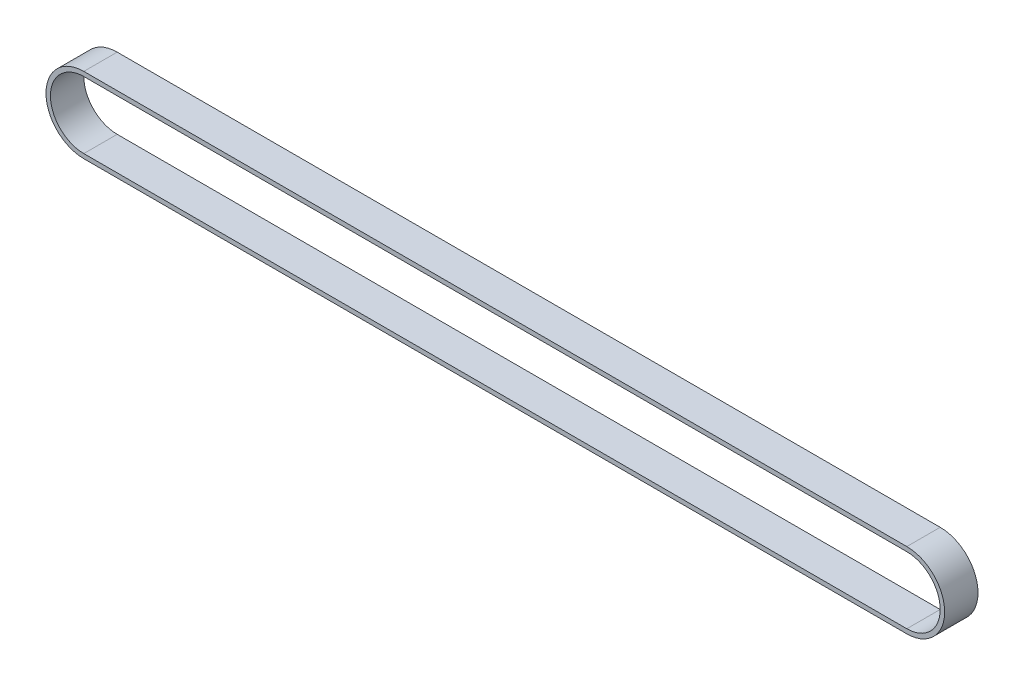
ISO-10303-21;
HEADER;
FILE_DESCRIPTION(('STEP AP214'),'2;1');
FILE_NAME('part.step','',(''),(''),'','','');
FILE_SCHEMA(('AUTOMOTIVE_DESIGN { 1 0 10303 214 1 1 1 1 }'));
ENDSEC;
DATA;
#1=APPLICATION_CONTEXT('core data for automotive mechanical design processes');
#2=APPLICATION_PROTOCOL_DEFINITION('international standard','automotive_design',2000,#1);
#3=PRODUCT_CONTEXT('',#1,'mechanical');
#4=PRODUCT('Part','Part','',(#3));
#5=PRODUCT_RELATED_PRODUCT_CATEGORY('part','',(#4));
#6=PRODUCT_DEFINITION_FORMATION('','',#4);
#7=PRODUCT_DEFINITION_CONTEXT('part definition',#1,'design');
#8=PRODUCT_DEFINITION('design','',#6,#7);
#9=PRODUCT_DEFINITION_SHAPE('','',#8);
#10=(LENGTH_UNIT() NAMED_UNIT(*) SI_UNIT(.MILLI.,.METRE.));
#11=(NAMED_UNIT(*) PLANE_ANGLE_UNIT() SI_UNIT($,.RADIAN.));
#12=(NAMED_UNIT(*) SI_UNIT($,.STERADIAN.) SOLID_ANGLE_UNIT());
#13=UNCERTAINTY_MEASURE_WITH_UNIT(LENGTH_MEASURE(1.E-05),#10,'distance_accuracy_value','');
#14=(GEOMETRIC_REPRESENTATION_CONTEXT(3) GLOBAL_UNCERTAINTY_ASSIGNED_CONTEXT((#13)) GLOBAL_UNIT_ASSIGNED_CONTEXT((#10,
#11,#12)) REPRESENTATION_CONTEXT('',''));
#15=CARTESIAN_POINT('',(0.,0.,0.));
#16=DIRECTION('',(0.,0.,1.));
#17=DIRECTION('',(1.,0.,0.));
#18=AXIS2_PLACEMENT_3D('',#15,#16,#17);
#19=CARTESIAN_POINT('',(0.,15.,15.));
#20=DIRECTION('',(0.,1.,0.));
#21=DIRECTION('',(-1.,0.,0.));
#22=AXIS2_PLACEMENT_3D('',#19,#20,#21);
#23=PLANE('',#22);
#24=DIRECTION('',(1.,0.,0.));
#25=VECTOR('',#24,1.);
#26=CARTESIAN_POINT('',(0.,15.,0.));
#27=LINE('',#26,#25);
#28=CARTESIAN_POINT('',(0.,15.,0.));
#29=VERTEX_POINT('',#28);
#30=CARTESIAN_POINT('',(370.,15.,0.));
#31=VERTEX_POINT('',#30);
#32=EDGE_CURVE('E154',#29,#31,#27,.T.);
#33=ORIENTED_EDGE('',*,*,#32,.T.);
#34=DIRECTION('',(0.,0.,-1.));
#35=VECTOR('',#34,1.);
#36=CARTESIAN_POINT('',(370.,15.,15.));
#37=LINE('',#36,#35);
#38=CARTESIAN_POINT('',(370.,15.,15.));
#39=VERTEX_POINT('',#38);
#40=EDGE_CURVE('E13',#39,#31,#37,.T.);
#41=ORIENTED_EDGE('',*,*,#40,.F.);
#42=DIRECTION('',(1.,0.,0.));
#43=VECTOR('',#42,1.);
#44=CARTESIAN_POINT('',(0.,15.,15.));
#45=LINE('',#44,#43);
#46=CARTESIAN_POINT('',(0.,15.,15.));
#47=VERTEX_POINT('',#46);
#48=EDGE_CURVE('E134',#47,#39,#45,.T.);
#49=ORIENTED_EDGE('',*,*,#48,.F.);
#50=DIRECTION('',(0.,0.,-1.));
#51=VECTOR('',#50,1.);
#52=CARTESIAN_POINT('',(0.,15.,15.));
#53=LINE('',#52,#51);
#54=EDGE_CURVE('E63',#47,#29,#53,.T.);
#55=ORIENTED_EDGE('',*,*,#54,.T.);
#56=EDGE_LOOP('',(#33,#41,#49,#55));
#57=FACE_BOUND('',#56,.T.);
#58=ADVANCED_FACE('F44',(#57),#23,.F.);
#59=CARTESIAN_POINT('',(370.,0.,15.));
#60=DIRECTION('',(0.,0.,-1.));
#61=DIRECTION('',(-1.,0.,0.));
#62=AXIS2_PLACEMENT_3D('',#59,#60,#61);
#63=CYLINDRICAL_SURFACE('',#62,15.);
#64=CARTESIAN_POINT('',(370.,0.,0.));
#65=DIRECTION('',(0.,0.,1.));
#66=DIRECTION('',(1.,0.,0.));
#67=AXIS2_PLACEMENT_3D('',#64,#65,#66);
#68=CIRCLE('',#67,15.);
#69=CARTESIAN_POINT('',(370.,-15.,0.));
#70=VERTEX_POINT('',#69);
#71=EDGE_CURVE('E123',#70,#31,#68,.T.);
#72=ORIENTED_EDGE('',*,*,#71,.F.);
#73=DIRECTION('',(0.,0.,-1.));
#74=VECTOR('',#73,1.);
#75=CARTESIAN_POINT('',(370.,-15.,15.));
#76=LINE('',#75,#74);
#77=CARTESIAN_POINT('',(370.,-15.,15.));
#78=VERTEX_POINT('',#77);
#79=EDGE_CURVE('E54',#78,#70,#76,.T.);
#80=ORIENTED_EDGE('',*,*,#79,.F.);
#81=CARTESIAN_POINT('',(370.,0.,15.));
#82=DIRECTION('',(0.,0.,1.));
#83=DIRECTION('',(1.,0.,0.));
#84=AXIS2_PLACEMENT_3D('',#81,#82,#83);
#85=CIRCLE('',#84,15.);
#86=EDGE_CURVE('E121',#78,#39,#85,.T.);
#87=ORIENTED_EDGE('',*,*,#86,.T.);
#88=ORIENTED_EDGE('',*,*,#40,.T.);
#89=EDGE_LOOP('',(#72,#80,#87,#88));
#90=FACE_BOUND('',#89,.T.);
#91=ADVANCED_FACE('F119',(#90),#63,.F.);
#92=CARTESIAN_POINT('',(0.,-15.,15.));
#93=DIRECTION('',(0.,-1.,0.));
#94=DIRECTION('',(0.,0.,-1.));
#95=AXIS2_PLACEMENT_3D('',#92,#93,#94);
#96=PLANE('',#95);
#97=DIRECTION('',(-1.,0.,0.));
#98=VECTOR('',#97,1.);
#99=CARTESIAN_POINT('',(0.,-15.,0.));
#100=LINE('',#99,#98);
#101=CARTESIAN_POINT('',(0.,-15.,0.));
#102=VERTEX_POINT('',#101);
#103=EDGE_CURVE('E157',#70,#102,#100,.T.);
#104=ORIENTED_EDGE('',*,*,#103,.T.);
#105=DIRECTION('',(0.,0.,-1.));
#106=VECTOR('',#105,1.);
#107=CARTESIAN_POINT('',(0.,-15.,15.));
#108=LINE('',#107,#106);
#109=CARTESIAN_POINT('',(0.,-15.,15.));
#110=VERTEX_POINT('',#109);
#111=EDGE_CURVE('E89',#110,#102,#108,.T.);
#112=ORIENTED_EDGE('',*,*,#111,.F.);
#113=DIRECTION('',(-1.,0.,0.));
#114=VECTOR('',#113,1.);
#115=CARTESIAN_POINT('',(0.,-15.,15.));
#116=LINE('',#115,#114);
#117=EDGE_CURVE('E127',#78,#110,#116,.T.);
#118=ORIENTED_EDGE('',*,*,#117,.F.);
#119=ORIENTED_EDGE('',*,*,#79,.T.);
#120=EDGE_LOOP('',(#104,#112,#118,#119));
#121=FACE_BOUND('',#120,.T.);
#122=ADVANCED_FACE('F128',(#121),#96,.F.);
#123=CARTESIAN_POINT('',(0.,-17.,15.));
#124=DIRECTION('',(0.,1.,0.));
#125=DIRECTION('',(0.,0.,1.));
#126=AXIS2_PLACEMENT_3D('',#123,#124,#125);
#127=PLANE('',#126);
#128=DIRECTION('',(1.,0.,0.));
#129=VECTOR('',#128,1.);
#130=CARTESIAN_POINT('',(0.,-17.,0.));
#131=LINE('',#130,#129);
#132=CARTESIAN_POINT('',(0.,-17.,0.));
#133=VERTEX_POINT('',#132);
#134=CARTESIAN_POINT('',(370.,-17.,0.));
#135=VERTEX_POINT('',#134);
#136=EDGE_CURVE('E143',#133,#135,#131,.T.);
#137=ORIENTED_EDGE('',*,*,#136,.T.);
#138=DIRECTION('',(0.,0.,-1.));
#139=VECTOR('',#138,1.);
#140=CARTESIAN_POINT('',(370.,-17.,15.));
#141=LINE('',#140,#139);
#142=CARTESIAN_POINT('',(370.,-17.,15.));
#143=VERTEX_POINT('',#142);
#144=EDGE_CURVE('E48',#143,#135,#141,.T.);
#145=ORIENTED_EDGE('',*,*,#144,.F.);
#146=DIRECTION('',(1.,0.,0.));
#147=VECTOR('',#146,1.);
#148=CARTESIAN_POINT('',(0.,-17.,15.));
#149=LINE('',#148,#147);
#150=CARTESIAN_POINT('',(0.,-17.,15.));
#151=VERTEX_POINT('',#150);
#152=EDGE_CURVE('E162',#151,#143,#149,.T.);
#153=ORIENTED_EDGE('',*,*,#152,.F.);
#154=DIRECTION('',(0.,0.,-1.));
#155=VECTOR('',#154,1.);
#156=CARTESIAN_POINT('',(0.,-17.,15.));
#157=LINE('',#156,#155);
#158=EDGE_CURVE('E142',#151,#133,#157,.T.);
#159=ORIENTED_EDGE('',*,*,#158,.T.);
#160=EDGE_LOOP('',(#137,#145,#153,#159));
#161=FACE_BOUND('',#160,.T.);
#162=ADVANCED_FACE('F46',(#161),#127,.F.);
#163=CARTESIAN_POINT('',(370.,0.,15.));
#164=DIRECTION('',(0.,0.,-1.));
#165=DIRECTION('',(-1.,0.,0.));
#166=AXIS2_PLACEMENT_3D('',#163,#164,#165);
#167=CYLINDRICAL_SURFACE('',#166,17.);
#168=CARTESIAN_POINT('',(370.,0.,0.));
#169=DIRECTION('',(0.,0.,1.));
#170=DIRECTION('',(1.,0.,0.));
#171=AXIS2_PLACEMENT_3D('',#168,#169,#170);
#172=CIRCLE('',#171,17.);
#173=CARTESIAN_POINT('',(370.,17.,0.));
#174=VERTEX_POINT('',#173);
#175=EDGE_CURVE('E146',#135,#174,#172,.T.);
#176=ORIENTED_EDGE('',*,*,#175,.T.);
#177=DIRECTION('',(0.,0.,-1.));
#178=VECTOR('',#177,1.);
#179=CARTESIAN_POINT('',(370.,17.,15.));
#180=LINE('',#179,#178);
#181=CARTESIAN_POINT('',(370.,17.,15.));
#182=VERTEX_POINT('',#181);
#183=EDGE_CURVE('E168',#182,#174,#180,.T.);
#184=ORIENTED_EDGE('',*,*,#183,.F.);
#185=CARTESIAN_POINT('',(370.,0.,15.));
#186=DIRECTION('',(0.,0.,1.));
#187=DIRECTION('',(1.,0.,0.));
#188=AXIS2_PLACEMENT_3D('',#185,#186,#187);
#189=CIRCLE('',#188,17.);
#190=EDGE_CURVE('E102',#143,#182,#189,.T.);
#191=ORIENTED_EDGE('',*,*,#190,.F.);
#192=ORIENTED_EDGE('',*,*,#144,.T.);
#193=EDGE_LOOP('',(#176,#184,#191,#192));
#194=FACE_BOUND('',#193,.T.);
#195=ADVANCED_FACE('F173',(#194),#167,.T.);
#196=CARTESIAN_POINT('',(0.,17.,15.));
#197=DIRECTION('',(0.,1.,0.));
#198=DIRECTION('',(-1.,0.,0.));
#199=AXIS2_PLACEMENT_3D('',#196,#197,#198);
#200=PLANE('',#199);
#201=DIRECTION('',(1.,0.,0.));
#202=VECTOR('',#201,1.);
#203=CARTESIAN_POINT('',(0.,17.,0.));
#204=LINE('',#203,#202);
#205=CARTESIAN_POINT('',(0.,17.,0.));
#206=VERTEX_POINT('',#205);
#207=EDGE_CURVE('E149',#206,#174,#204,.T.);
#208=ORIENTED_EDGE('',*,*,#207,.F.);
#209=DIRECTION('',(0.,0.,-1.));
#210=VECTOR('',#209,1.);
#211=CARTESIAN_POINT('',(0.,17.,15.));
#212=LINE('',#211,#210);
#213=CARTESIAN_POINT('',(0.,17.,15.));
#214=VERTEX_POINT('',#213);
#215=EDGE_CURVE('E167',#214,#206,#212,.T.);
#216=ORIENTED_EDGE('',*,*,#215,.F.);
#217=DIRECTION('',(1.,0.,0.));
#218=VECTOR('',#217,1.);
#219=CARTESIAN_POINT('',(0.,17.,15.));
#220=LINE('',#219,#218);
#221=EDGE_CURVE('E185',#214,#182,#220,.T.);
#222=ORIENTED_EDGE('',*,*,#221,.T.);
#223=ORIENTED_EDGE('',*,*,#183,.T.);
#224=EDGE_LOOP('',(#208,#216,#222,#223));
#225=FACE_BOUND('',#224,.T.);
#226=ADVANCED_FACE('F182',(#225),#200,.T.);
#227=CARTESIAN_POINT('',(0.,0.,15.));
#228=DIRECTION('',(0.,0.,-1.));
#229=DIRECTION('',(-1.,0.,0.));
#230=AXIS2_PLACEMENT_3D('',#227,#228,#229);
#231=CYLINDRICAL_SURFACE('',#230,17.);
#232=CARTESIAN_POINT('',(0.,0.,0.));
#233=DIRECTION('',(0.,0.,1.));
#234=DIRECTION('',(1.,0.,0.));
#235=AXIS2_PLACEMENT_3D('',#232,#233,#234);
#236=CIRCLE('',#235,17.);
#237=EDGE_CURVE('E152',#206,#133,#236,.T.);
#238=ORIENTED_EDGE('',*,*,#237,.T.);
#239=ORIENTED_EDGE('',*,*,#158,.F.);
#240=CARTESIAN_POINT('',(0.,0.,15.));
#241=DIRECTION('',(0.,0.,1.));
#242=DIRECTION('',(1.,0.,0.));
#243=AXIS2_PLACEMENT_3D('',#240,#241,#242);
#244=CIRCLE('',#243,17.);
#245=EDGE_CURVE('E137',#214,#151,#244,.T.);
#246=ORIENTED_EDGE('',*,*,#245,.F.);
#247=ORIENTED_EDGE('',*,*,#215,.T.);
#248=EDGE_LOOP('',(#238,#239,#246,#247));
#249=FACE_BOUND('',#248,.T.);
#250=ADVANCED_FACE('F187',(#249),#231,.T.);
#251=CARTESIAN_POINT('',(0.,0.,15.));
#252=DIRECTION('',(0.,0.,-1.));
#253=DIRECTION('',(-1.,0.,0.));
#254=AXIS2_PLACEMENT_3D('',#251,#252,#253);
#255=CYLINDRICAL_SURFACE('',#254,15.);
#256=CARTESIAN_POINT('',(0.,0.,0.));
#257=DIRECTION('',(0.,0.,1.));
#258=DIRECTION('',(1.,0.,0.));
#259=AXIS2_PLACEMENT_3D('',#256,#257,#258);
#260=CIRCLE('',#259,15.);
#261=EDGE_CURVE('E159',#29,#102,#260,.T.);
#262=ORIENTED_EDGE('',*,*,#261,.F.);
#263=ORIENTED_EDGE('',*,*,#54,.F.);
#264=CARTESIAN_POINT('',(0.,0.,15.));
#265=DIRECTION('',(0.,0.,1.));
#266=DIRECTION('',(1.,0.,0.));
#267=AXIS2_PLACEMENT_3D('',#264,#265,#266);
#268=CIRCLE('',#267,15.);
#269=EDGE_CURVE('E131',#47,#110,#268,.T.);
#270=ORIENTED_EDGE('',*,*,#269,.T.);
#271=ORIENTED_EDGE('',*,*,#111,.T.);
#272=EDGE_LOOP('',(#262,#263,#270,#271));
#273=FACE_BOUND('',#272,.T.);
#274=ADVANCED_FACE('F193',(#273),#255,.F.);
#275=CARTESIAN_POINT('',(0.,0.,15.));
#276=DIRECTION('',(0.,0.,1.));
#277=DIRECTION('',(1.,0.,0.));
#278=AXIS2_PLACEMENT_3D('',#275,#276,#277);
#279=PLANE('',#278);
#280=ORIENTED_EDGE('',*,*,#152,.T.);
#281=ORIENTED_EDGE('',*,*,#190,.T.);
#282=ORIENTED_EDGE('',*,*,#221,.F.);
#283=ORIENTED_EDGE('',*,*,#245,.T.);
#284=EDGE_LOOP('',(#280,#281,#282,#283));
#285=FACE_BOUND('',#284,.T.);
#286=ORIENTED_EDGE('',*,*,#48,.T.);
#287=ORIENTED_EDGE('',*,*,#86,.F.);
#288=ORIENTED_EDGE('',*,*,#117,.T.);
#289=ORIENTED_EDGE('',*,*,#269,.F.);
#290=EDGE_LOOP('',(#286,#287,#288,#289));
#291=FACE_BOUND('',#290,.T.);
#292=ADVANCED_FACE('F133',(#285,#291),#279,.T.);
#293=CARTESIAN_POINT('',(0.,0.,0.));
#294=DIRECTION('',(0.,0.,1.));
#295=DIRECTION('',(1.,0.,0.));
#296=AXIS2_PLACEMENT_3D('',#293,#294,#295);
#297=PLANE('',#296);
#298=ORIENTED_EDGE('',*,*,#136,.F.);
#299=ORIENTED_EDGE('',*,*,#237,.F.);
#300=ORIENTED_EDGE('',*,*,#207,.T.);
#301=ORIENTED_EDGE('',*,*,#175,.F.);
#302=EDGE_LOOP('',(#298,#299,#300,#301));
#303=FACE_BOUND('',#302,.T.);
#304=ORIENTED_EDGE('',*,*,#32,.F.);
#305=ORIENTED_EDGE('',*,*,#261,.T.);
#306=ORIENTED_EDGE('',*,*,#103,.F.);
#307=ORIENTED_EDGE('',*,*,#71,.T.);
#308=EDGE_LOOP('',(#304,#305,#306,#307));
#309=FACE_BOUND('',#308,.T.);
#310=ADVANCED_FACE('F180',(#303,#309),#297,.F.);
#311=CLOSED_SHELL('',(#58,#91,#122,#162,#195,#226,#250,#274,#292,#310));
#312=MANIFOLD_SOLID_BREP('B2',#311);
#313=ADVANCED_BREP_SHAPE_REPRESENTATION('',(#18,#312),#14);
#314=SHAPE_DEFINITION_REPRESENTATION(#9,#313);
ENDSEC;
END-ISO-10303-21;
